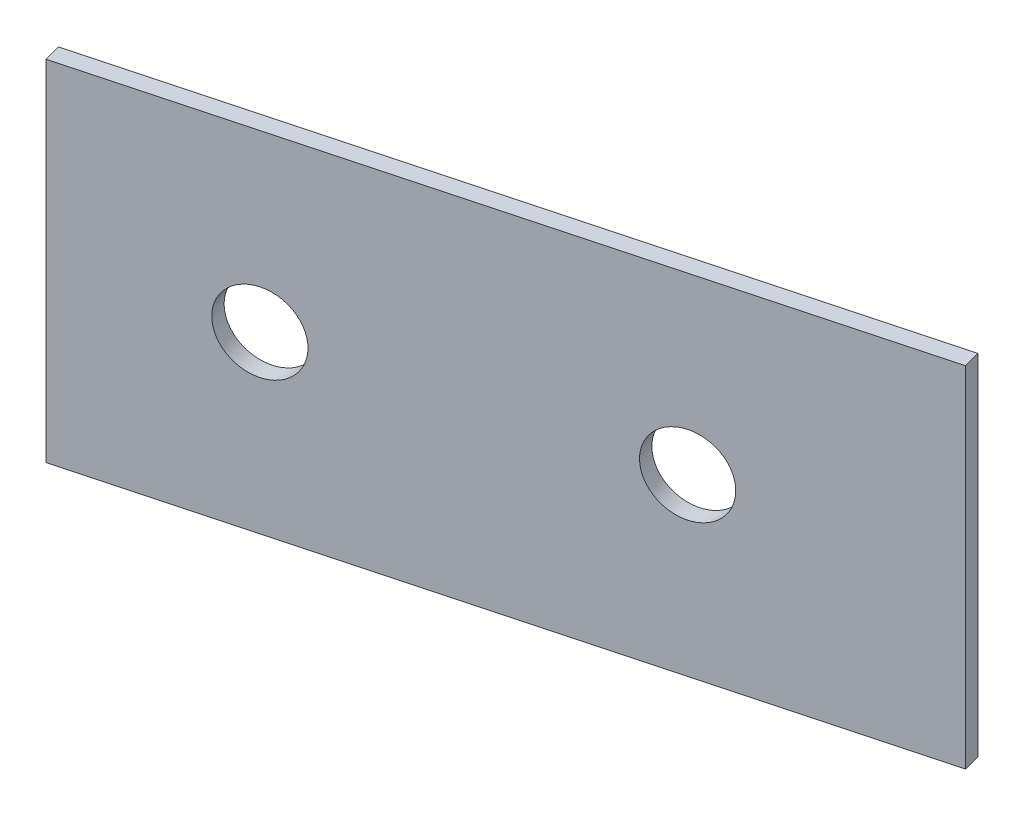
ISO-10303-21;
HEADER;
FILE_DESCRIPTION(('STEP AP214'),'2;1');
FILE_NAME('part.step','',(''),(''),'','','');
FILE_SCHEMA(('AUTOMOTIVE_DESIGN { 1 0 10303 214 1 1 1 1 }'));
ENDSEC;
DATA;
#1=APPLICATION_CONTEXT('core data for automotive mechanical design processes');
#2=APPLICATION_PROTOCOL_DEFINITION('international standard','automotive_design',2000,#1);
#3=PRODUCT_CONTEXT('',#1,'mechanical');
#4=PRODUCT('Part','Part','',(#3));
#5=PRODUCT_RELATED_PRODUCT_CATEGORY('part','',(#4));
#6=PRODUCT_DEFINITION_FORMATION('','',#4);
#7=PRODUCT_DEFINITION_CONTEXT('part definition',#1,'design');
#8=PRODUCT_DEFINITION('design','',#6,#7);
#9=PRODUCT_DEFINITION_SHAPE('','',#8);
#10=(LENGTH_UNIT() NAMED_UNIT(*) SI_UNIT(.MILLI.,.METRE.));
#11=(NAMED_UNIT(*) PLANE_ANGLE_UNIT() SI_UNIT($,.RADIAN.));
#12=(NAMED_UNIT(*) SI_UNIT($,.STERADIAN.) SOLID_ANGLE_UNIT());
#13=UNCERTAINTY_MEASURE_WITH_UNIT(LENGTH_MEASURE(1.E-05),#10,'distance_accuracy_value','');
#14=(GEOMETRIC_REPRESENTATION_CONTEXT(3) GLOBAL_UNCERTAINTY_ASSIGNED_CONTEXT((#13)) GLOBAL_UNIT_ASSIGNED_CONTEXT((#10,
#11,#12)) REPRESENTATION_CONTEXT('',''));
#15=CARTESIAN_POINT('',(0.,0.,0.));
#16=DIRECTION('',(0.,0.,1.));
#17=DIRECTION('',(1.,0.,0.));
#18=AXIS2_PLACEMENT_3D('',#15,#16,#17);
#19=CARTESIAN_POINT('',(905.36051641047,610.,2451.891756604));
#20=DIRECTION('',(-0.258819045102985,0.,-0.965925826288944));
#21=DIRECTION('',(0.,1.,0.));
#22=AXIS2_PLACEMENT_3D('',#19,#20,#21);
#23=CYLINDRICAL_SURFACE('',#22,4.5);
#24=CARTESIAN_POINT('',(905.38639831498,610.,2451.988349187));
#25=DIRECTION('',(-0.258819045102985,0.,-0.965925826288944));
#26=DIRECTION('',(0.,1.,0.));
#27=AXIS2_PLACEMENT_3D('',#24,#25,#26);
#28=CIRCLE('',#27,4.5);
#29=CARTESIAN_POINT('',(905.38639831498,614.5,2451.988349187));
#30=VERTEX_POINT('',#29);
#31=EDGE_CURVE('E69',#30,#30,#28,.T.);
#32=ORIENTED_EDGE('',*,*,#31,.T.);
#33=DIRECTION('',(0.258819045102985,0.,0.965925826288944));
#34=VECTOR('',#33,1.);
#35=CARTESIAN_POINT('',(905.36051641047,614.5,2451.891756604));
#36=LINE('',#35,#34);
#37=CARTESIAN_POINT('',(905.90403640519,614.5,2453.920200839));
#38=VERTEX_POINT('',#37);
#39=EDGE_CURVE('E11',#30,#38,#36,.T.);
#40=ORIENTED_EDGE('',*,*,#39,.T.);
#41=CARTESIAN_POINT('',(905.90403640518,610.,2453.920200839));
#42=DIRECTION('',(-0.258819045102985,0.,-0.965925826288944));
#43=DIRECTION('',(0.,1.,0.));
#44=AXIS2_PLACEMENT_3D('',#41,#42,#43);
#45=CIRCLE('',#44,4.5);
#46=EDGE_CURVE('E67',#38,#38,#45,.T.);
#47=ORIENTED_EDGE('',*,*,#46,.F.);
#48=ORIENTED_EDGE('',*,*,#39,.F.);
#49=EDGE_LOOP('',(#32,#40,#47,#48));
#50=FACE_BOUND('',#49,.T.);
#51=ADVANCED_FACE('F17',(#50),#23,.F.);
#52=CARTESIAN_POINT('',(943.99754946203,610.,2441.5389948));
#53=DIRECTION('',(-0.258819045102985,0.,-0.965925826288944));
#54=DIRECTION('',(0.,1.,0.));
#55=AXIS2_PLACEMENT_3D('',#52,#53,#54);
#56=CYLINDRICAL_SURFACE('',#55,4.5);
#57=CARTESIAN_POINT('',(944.02343136654,610.,2441.635587383));
#58=DIRECTION('',(-0.258819045102985,0.,-0.965925826288944));
#59=DIRECTION('',(0.,1.,0.));
#60=AXIS2_PLACEMENT_3D('',#57,#58,#59);
#61=CIRCLE('',#60,4.5);
#62=CARTESIAN_POINT('',(944.02343136654,614.5,2441.635587383));
#63=VERTEX_POINT('',#62);
#64=EDGE_CURVE('E99',#63,#63,#61,.T.);
#65=ORIENTED_EDGE('',*,*,#64,.T.);
#66=DIRECTION('',(0.258819045102985,0.,0.965925826288944));
#67=VECTOR('',#66,1.);
#68=CARTESIAN_POINT('',(943.99754946203,614.5,2441.5389948));
#69=LINE('',#68,#67);
#70=CARTESIAN_POINT('',(944.54106945675,614.5,2443.567439035));
#71=VERTEX_POINT('',#70);
#72=EDGE_CURVE('E25',#63,#71,#69,.T.);
#73=ORIENTED_EDGE('',*,*,#72,.T.);
#74=CARTESIAN_POINT('',(944.54106945675,610.,2443.567439035));
#75=DIRECTION('',(-0.258819045102985,0.,-0.965925826288944));
#76=DIRECTION('',(0.,1.,0.));
#77=AXIS2_PLACEMENT_3D('',#74,#75,#76);
#78=CIRCLE('',#77,4.5);
#79=EDGE_CURVE('E75',#71,#71,#78,.T.);
#80=ORIENTED_EDGE('',*,*,#79,.F.);
#81=ORIENTED_EDGE('',*,*,#72,.F.);
#82=EDGE_LOOP('',(#65,#73,#80,#81));
#83=FACE_BOUND('',#82,.T.);
#84=ADVANCED_FACE('F105',(#83),#56,.F.);
#85=CARTESIAN_POINT('',(969.13750285006,630.,2434.90629221));
#86=DIRECTION('',(0.,1.,0.));
#87=DIRECTION('',(1.,0.,0.));
#88=AXIS2_PLACEMENT_3D('',#85,#86,#87);
#89=PLANE('',#88);
#90=DIRECTION('',(0.258819045102985,0.,0.965925826288944));
#91=VECTOR('',#90,1.);
#92=CARTESIAN_POINT('',(969.13750285006,630.,2434.90629221));
#93=LINE('',#92,#91);
#94=CARTESIAN_POINT('',(969.13750285006,630.,2434.90629221));
#95=VERTEX_POINT('',#94);
#96=CARTESIAN_POINT('',(969.65514094026,630.,2436.838143863));
#97=VERTEX_POINT('',#96);
#98=EDGE_CURVE('E143',#95,#97,#93,.T.);
#99=ORIENTED_EDGE('',*,*,#98,.F.);
#100=DIRECTION('',(-0.965925826288944,0.,0.258819045102985));
#101=VECTOR('',#100,1.);
#102=CARTESIAN_POINT('',(969.13750285006,630.,2434.90629221));
#103=LINE('',#102,#101);
#104=CARTESIAN_POINT('',(886.0678817892,630.,2457.164730089));
#105=VERTEX_POINT('',#104);
#106=EDGE_CURVE('E96',#95,#105,#103,.T.);
#107=ORIENTED_EDGE('',*,*,#106,.T.);
#108=DIRECTION('',(0.258819045102985,0.,0.965925826288944));
#109=VECTOR('',#108,1.);
#110=CARTESIAN_POINT('',(886.0678817892,630.,2457.164730089));
#111=LINE('',#110,#109);
#112=CARTESIAN_POINT('',(886.5855198794,630.,2459.096581741));
#113=VERTEX_POINT('',#112);
#114=EDGE_CURVE('E82',#105,#113,#111,.T.);
#115=ORIENTED_EDGE('',*,*,#114,.T.);
#116=DIRECTION('',(-0.965925826288944,0.,0.258819045102985));
#117=VECTOR('',#116,1.);
#118=CARTESIAN_POINT('',(969.65514094026,630.,2436.838143863));
#119=LINE('',#118,#117);
#120=EDGE_CURVE('E93',#97,#113,#119,.T.);
#121=ORIENTED_EDGE('',*,*,#120,.F.);
#122=EDGE_LOOP('',(#99,#107,#115,#121));
#123=FACE_BOUND('',#122,.T.);
#124=ADVANCED_FACE('F161',(#123),#89,.T.);
#125=CARTESIAN_POINT('',(969.13750285006,590.,2434.90629221));
#126=DIRECTION('',(0.258819045102985,0.,0.965925826288944));
#127=DIRECTION('',(0.,-1.,0.));
#128=AXIS2_PLACEMENT_3D('',#125,#126,#127);
#129=PLANE('',#128);
#130=ORIENTED_EDGE('',*,*,#31,.F.);
#131=EDGE_LOOP('',(#130));
#132=FACE_BOUND('',#131,.T.);
#133=ORIENTED_EDGE('',*,*,#64,.F.);
#134=EDGE_LOOP('',(#133));
#135=FACE_BOUND('',#134,.T.);
#136=DIRECTION('',(0.,1.,0.));
#137=VECTOR('',#136,1.);
#138=CARTESIAN_POINT('',(886.0678817892,590.,2457.164730089));
#139=LINE('',#138,#137);
#140=CARTESIAN_POINT('',(886.0678817892,590.,2457.164730089));
#141=VERTEX_POINT('',#140);
#142=EDGE_CURVE('E74',#141,#105,#139,.T.);
#143=ORIENTED_EDGE('',*,*,#142,.T.);
#144=ORIENTED_EDGE('',*,*,#106,.F.);
#145=DIRECTION('',(0.,1.,0.));
#146=VECTOR('',#145,1.);
#147=CARTESIAN_POINT('',(969.13750285006,590.,2434.90629221));
#148=LINE('',#147,#146);
#149=CARTESIAN_POINT('',(969.13750285006,590.,2434.90629221));
#150=VERTEX_POINT('',#149);
#151=EDGE_CURVE('E91',#150,#95,#148,.T.);
#152=ORIENTED_EDGE('',*,*,#151,.F.);
#153=DIRECTION('',(-0.965925826288944,0.,0.258819045102985));
#154=VECTOR('',#153,1.);
#155=CARTESIAN_POINT('',(969.13750285006,590.,2434.90629221));
#156=LINE('',#155,#154);
#157=EDGE_CURVE('E134',#150,#141,#156,.T.);
#158=ORIENTED_EDGE('',*,*,#157,.T.);
#159=EDGE_LOOP('',(#143,#144,#152,#158));
#160=FACE_BOUND('',#159,.T.);
#161=ADVANCED_FACE('F176',(#132,#135,#160),#129,.F.);
#162=CARTESIAN_POINT('',(886.0678817892,590.,2457.164730089));
#163=DIRECTION('',(-0.965925826288944,0.,0.258819045102985));
#164=DIRECTION('',(0.,1.,0.));
#165=AXIS2_PLACEMENT_3D('',#162,#163,#164);
#166=PLANE('',#165);
#167=ORIENTED_EDGE('',*,*,#142,.F.);
#168=DIRECTION('',(0.258819045102985,0.,0.965925826288944));
#169=VECTOR('',#168,1.);
#170=CARTESIAN_POINT('',(886.0678817892,590.,2457.164730089));
#171=LINE('',#170,#169);
#172=CARTESIAN_POINT('',(886.5855198794,590.,2459.096581741));
#173=VERTEX_POINT('',#172);
#174=EDGE_CURVE('E130',#141,#173,#171,.T.);
#175=ORIENTED_EDGE('',*,*,#174,.T.);
#176=DIRECTION('',(0.,1.,0.));
#177=VECTOR('',#176,1.);
#178=CARTESIAN_POINT('',(886.5855198794,590.,2459.096581741));
#179=LINE('',#178,#177);
#180=EDGE_CURVE('E86',#173,#113,#179,.T.);
#181=ORIENTED_EDGE('',*,*,#180,.T.);
#182=ORIENTED_EDGE('',*,*,#114,.F.);
#183=EDGE_LOOP('',(#167,#175,#181,#182));
#184=FACE_BOUND('',#183,.T.);
#185=ADVANCED_FACE('F110',(#184),#166,.T.);
#186=CARTESIAN_POINT('',(969.65514094026,590.,2436.838143863));
#187=DIRECTION('',(0.258819045102985,0.,0.965925826288944));
#188=DIRECTION('',(0.,-1.,0.));
#189=AXIS2_PLACEMENT_3D('',#186,#187,#188);
#190=PLANE('',#189);
#191=ORIENTED_EDGE('',*,*,#46,.T.);
#192=EDGE_LOOP('',(#191));
#193=FACE_BOUND('',#192,.T.);
#194=ORIENTED_EDGE('',*,*,#79,.T.);
#195=EDGE_LOOP('',(#194));
#196=FACE_BOUND('',#195,.T.);
#197=DIRECTION('',(-0.965925826288944,0.,0.258819045102985));
#198=VECTOR('',#197,1.);
#199=CARTESIAN_POINT('',(969.65514094026,590.,2436.838143863));
#200=LINE('',#199,#198);
#201=CARTESIAN_POINT('',(969.65514094026,590.,2436.838143863));
#202=VERTEX_POINT('',#201);
#203=EDGE_CURVE('E117',#202,#173,#200,.T.);
#204=ORIENTED_EDGE('',*,*,#203,.F.);
#205=DIRECTION('',(0.,1.,0.));
#206=VECTOR('',#205,1.);
#207=CARTESIAN_POINT('',(969.65514094026,590.,2436.838143863));
#208=LINE('',#207,#206);
#209=EDGE_CURVE('E94',#202,#97,#208,.T.);
#210=ORIENTED_EDGE('',*,*,#209,.T.);
#211=ORIENTED_EDGE('',*,*,#120,.T.);
#212=ORIENTED_EDGE('',*,*,#180,.F.);
#213=EDGE_LOOP('',(#204,#210,#211,#212));
#214=FACE_BOUND('',#213,.T.);
#215=ADVANCED_FACE('F71',(#193,#196,#214),#190,.T.);
#216=CARTESIAN_POINT('',(969.13750285006,590.,2434.90629221));
#217=DIRECTION('',(-0.965925826288944,0.,0.258819045102985));
#218=DIRECTION('',(0.,1.,0.));
#219=AXIS2_PLACEMENT_3D('',#216,#217,#218);
#220=PLANE('',#219);
#221=ORIENTED_EDGE('',*,*,#98,.T.);
#222=ORIENTED_EDGE('',*,*,#209,.F.);
#223=DIRECTION('',(0.258819045102985,0.,0.965925826288944));
#224=VECTOR('',#223,1.);
#225=CARTESIAN_POINT('',(969.13750285006,590.,2434.90629221));
#226=LINE('',#225,#224);
#227=EDGE_CURVE('E140',#150,#202,#226,.T.);
#228=ORIENTED_EDGE('',*,*,#227,.F.);
#229=ORIENTED_EDGE('',*,*,#151,.T.);
#230=EDGE_LOOP('',(#221,#222,#228,#229));
#231=FACE_BOUND('',#230,.T.);
#232=ADVANCED_FACE('F109',(#231),#220,.F.);
#233=CARTESIAN_POINT('',(969.13750285006,590.,2434.90629221));
#234=DIRECTION('',(0.,1.,0.));
#235=DIRECTION('',(1.,0.,0.));
#236=AXIS2_PLACEMENT_3D('',#233,#234,#235);
#237=PLANE('',#236);
#238=ORIENTED_EDGE('',*,*,#203,.T.);
#239=ORIENTED_EDGE('',*,*,#174,.F.);
#240=ORIENTED_EDGE('',*,*,#157,.F.);
#241=ORIENTED_EDGE('',*,*,#227,.T.);
#242=EDGE_LOOP('',(#238,#239,#240,#241));
#243=FACE_BOUND('',#242,.T.);
#244=ADVANCED_FACE('F179',(#243),#237,.F.);
#245=CLOSED_SHELL('',(#51,#84,#124,#161,#185,#215,#232,#244));
#246=MANIFOLD_SOLID_BREP('B1',#245);
#247=ADVANCED_BREP_SHAPE_REPRESENTATION('',(#18,#246),#14);
#248=SHAPE_DEFINITION_REPRESENTATION(#9,#247);
ENDSEC;
END-ISO-10303-21;
